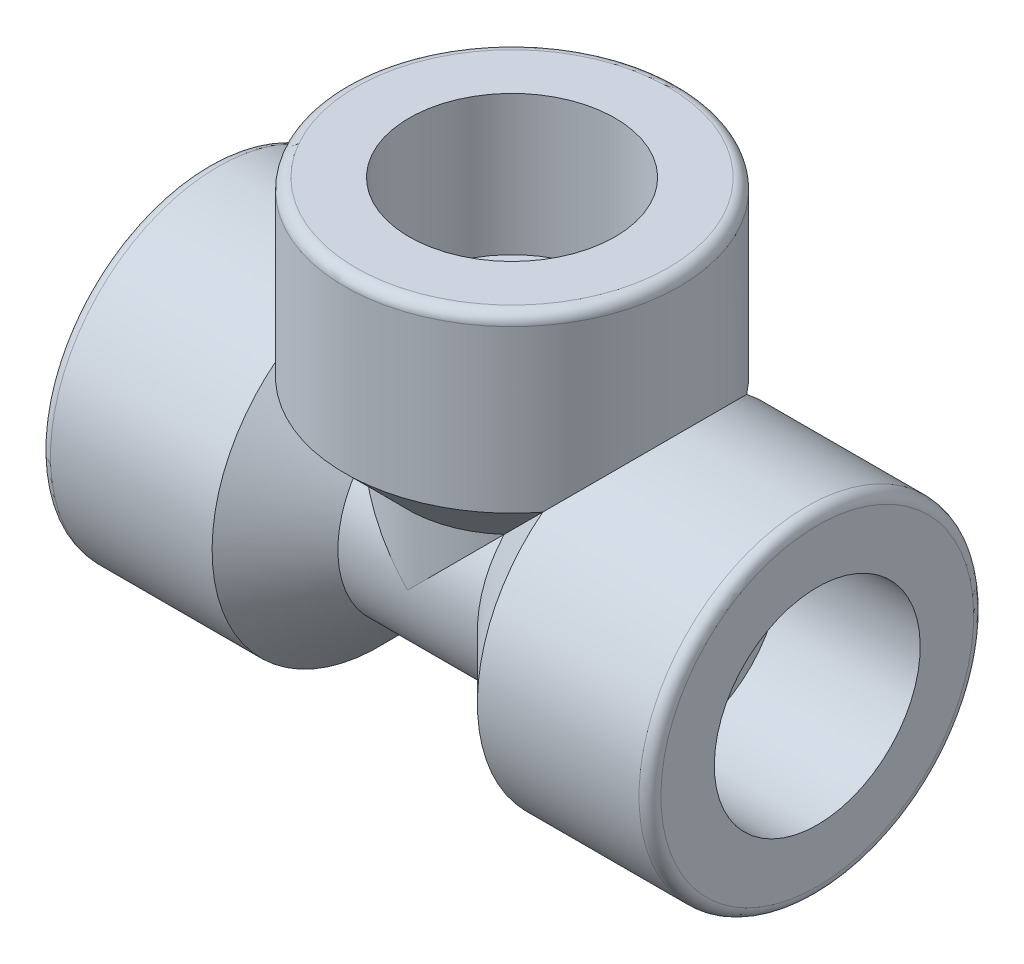
ISO-10303-21;
HEADER;
FILE_DESCRIPTION(('STEP AP214'),'2;1');
FILE_NAME('part.step','',(''),(''),'','','');
FILE_SCHEMA(('AUTOMOTIVE_DESIGN { 1 0 10303 214 1 1 1 1 }'));
ENDSEC;
DATA;
#1=APPLICATION_CONTEXT('core data for automotive mechanical design processes');
#2=APPLICATION_PROTOCOL_DEFINITION('international standard','automotive_design',2000,#1);
#3=PRODUCT_CONTEXT('',#1,'mechanical');
#4=PRODUCT('Part','Part','',(#3));
#5=PRODUCT_RELATED_PRODUCT_CATEGORY('part','',(#4));
#6=PRODUCT_DEFINITION_FORMATION('','',#4);
#7=PRODUCT_DEFINITION_CONTEXT('part definition',#1,'design');
#8=PRODUCT_DEFINITION('design','',#6,#7);
#9=PRODUCT_DEFINITION_SHAPE('','',#8);
#10=(LENGTH_UNIT() NAMED_UNIT(*) SI_UNIT(.MILLI.,.METRE.));
#11=(NAMED_UNIT(*) PLANE_ANGLE_UNIT() SI_UNIT($,.RADIAN.));
#12=(NAMED_UNIT(*) SI_UNIT($,.STERADIAN.) SOLID_ANGLE_UNIT());
#13=UNCERTAINTY_MEASURE_WITH_UNIT(LENGTH_MEASURE(1.E-05),#10,'distance_accuracy_value','');
#14=(GEOMETRIC_REPRESENTATION_CONTEXT(3) GLOBAL_UNCERTAINTY_ASSIGNED_CONTEXT((#13)) GLOBAL_UNIT_ASSIGNED_CONTEXT((#10,
#11,#12)) REPRESENTATION_CONTEXT('',''));
#15=CARTESIAN_POINT('',(0.,0.,0.));
#16=DIRECTION('',(0.,0.,1.));
#17=DIRECTION('',(1.,0.,0.));
#18=AXIS2_PLACEMENT_3D('',#15,#16,#17);
#19=CARTESIAN_POINT('',(0.,0.,0.));
#20=DIRECTION('',(1.,0.,0.));
#21=DIRECTION('',(0.,1.,0.));
#22=AXIS2_PLACEMENT_3D('',#19,#20,#21);
#23=CYLINDRICAL_SURFACE('',#22,4.191);
#24=CARTESIAN_POINT('',(11.43,0.,0.));
#25=DIRECTION('',(-1.,0.,0.));
#26=DIRECTION('',(0.,-1.,0.));
#27=AXIS2_PLACEMENT_3D('',#24,#25,#26);
#28=CIRCLE('',#27,4.191);
#29=CARTESIAN_POINT('',(11.43,-4.19100000000007,0.));
#30=VERTEX_POINT('',#29);
#31=EDGE_CURVE('E164',#30,#30,#28,.T.);
#32=ORIENTED_EDGE('',*,*,#31,.F.);
#33=EDGE_LOOP('',(#32));
#34=FACE_BOUND('',#33,.T.);
#35=CARTESIAN_POINT('',(-11.43,0.,0.));
#36=DIRECTION('',(1.,0.,0.));
#37=DIRECTION('',(0.,1.,0.));
#38=AXIS2_PLACEMENT_3D('',#35,#36,#37);
#39=CIRCLE('',#38,4.191);
#40=CARTESIAN_POINT('',(-11.43,4.19099999999999,0.));
#41=VERTEX_POINT('',#40);
#42=EDGE_CURVE('E293',#41,#41,#39,.T.);
#43=ORIENTED_EDGE('',*,*,#42,.F.);
#44=EDGE_LOOP('',(#43));
#45=FACE_BOUND('',#44,.T.);
#46=CARTESIAN_POINT('',(0.,0.,0.));
#47=DIRECTION('',(0.707106781186548,-0.707106781186548,0.));
#48=DIRECTION('',(0.707106781186548,0.707106781186547,0.));
#49=AXIS2_PLACEMENT_3D('',#46,#47,#48);
#50=ELLIPSE('',#49,5.92696903990564,4.191);
#51=CARTESIAN_POINT('',(0.,0.,-4.191));
#52=VERTEX_POINT('',#51);
#53=CARTESIAN_POINT('',(0.,0.,4.191));
#54=VERTEX_POINT('',#53);
#55=EDGE_CURVE('E115',#52,#54,#50,.T.);
#56=ORIENTED_EDGE('',*,*,#55,.F.);
#57=CARTESIAN_POINT('',(0.,0.,0.));
#58=DIRECTION('',(0.707106781186548,0.707106781186547,0.));
#59=DIRECTION('',(0.707106781186548,-0.707106781186548,0.));
#60=AXIS2_PLACEMENT_3D('',#57,#58,#59);
#61=ELLIPSE('',#60,5.92696903990564,4.191);
#62=EDGE_CURVE('E152',#54,#52,#61,.F.);
#63=ORIENTED_EDGE('',*,*,#62,.F.);
#64=EDGE_LOOP('',(#56,#63));
#65=FACE_BOUND('',#64,.T.);
#66=ADVANCED_FACE('F101',(#34,#45,#65),#23,.F.);
#67=CARTESIAN_POINT('',(0.,0.,0.));
#68=DIRECTION('',(1.,0.,0.));
#69=DIRECTION('',(0.,1.,0.));
#70=AXIS2_PLACEMENT_3D('',#67,#68,#69);
#71=CYLINDRICAL_SURFACE('',#70,11.557);
#72=CARTESIAN_POINT('',(-20.32635,0.,0.));
#73=DIRECTION('',(1.,0.,0.));
#74=DIRECTION('',(0.,1.,0.));
#75=AXIS2_PLACEMENT_3D('',#72,#73,#74);
#76=CIRCLE('',#75,11.557);
#77=CARTESIAN_POINT('',(-20.32635,11.557,0.));
#78=VERTEX_POINT('',#77);
#79=EDGE_CURVE('E109',#78,#78,#76,.T.);
#80=ORIENTED_EDGE('',*,*,#79,.T.);
#81=EDGE_LOOP('',(#80));
#82=FACE_BOUND('',#81,.T.);
#83=CARTESIAN_POINT('',(0.,0.,0.));
#84=DIRECTION('',(0.707106781186549,0.707106781186546,0.));
#85=DIRECTION('',(0.707106781186546,-0.707106781186549,0.));
#86=AXIS2_PLACEMENT_3D('',#83,#84,#85);
#87=ELLIPSE('',#86,16.3440661403458,11.557);
#88=CARTESIAN_POINT('',(-9.16304999999999,9.16305000000002,-7.04292295126813));
#89=VERTEX_POINT('',#88);
#90=CARTESIAN_POINT('',(-9.16304999999999,9.16305000000003,7.04292295126813));
#91=VERTEX_POINT('',#90);
#92=EDGE_CURVE('E122',#89,#91,#87,.T.);
#93=ORIENTED_EDGE('',*,*,#92,.F.);
#94=CARTESIAN_POINT('',(-9.16305,0.,0.));
#95=DIRECTION('',(1.,0.,0.));
#96=DIRECTION('',(0.,1.,0.));
#97=AXIS2_PLACEMENT_3D('',#94,#95,#96);
#98=CIRCLE('',#97,11.557);
#99=EDGE_CURVE('E299',#91,#89,#98,.T.);
#100=ORIENTED_EDGE('',*,*,#99,.F.);
#101=EDGE_LOOP('',(#93,#100));
#102=FACE_BOUND('',#101,.T.);
#103=ADVANCED_FACE('F247',(#82,#102),#71,.T.);
#104=CARTESIAN_POINT('',(-9.16305,0.,0.));
#105=DIRECTION('',(-1.,0.,0.));
#106=DIRECTION('',(0.,-1.,0.));
#107=AXIS2_PLACEMENT_3D('',#104,#105,#106);
#108=CONICAL_SURFACE('',#107,11.557,0.785398163397451);
#109=CARTESIAN_POINT('',(1.19697500001641,-1.19697500001643,4.4342035988794E-06));
#110=CARTESIAN_POINT('',(1.19697836620666,-1.19697836620423,-0.0376505705711459));
#111=CARTESIAN_POINT('',(1.19608613541275,-1.19608613540982,-0.0752938622259102));
#112=CARTESIAN_POINT('',(1.19254436069482,-1.19254436069239,-0.150401745617256));
#113=CARTESIAN_POINT('',(1.18989543995814,-1.18989543995672,-0.187866395981631));
#114=CARTESIAN_POINT('',(1.17939486010733,-1.1793948601077,-0.299466042307876));
#115=CARTESIAN_POINT('',(1.16898874466563,-1.16898874466556,-0.373145913181798));
#116=CARTESIAN_POINT('',(1.14229768219998,-1.14229768219964,-0.516557276062976));
#117=CARTESIAN_POINT('',(1.12614636715457,-1.12614636715439,-0.586339887954223));
#118=CARTESIAN_POINT('',(1.08873038336302,-1.08873038336298,-0.723152238154118));
#119=CARTESIAN_POINT('',(1.06746102034273,-1.06746102034267,-0.790179382681073));
#120=CARTESIAN_POINT('',(1.02180582651157,-1.02180582651151,-0.917917484823124));
#121=CARTESIAN_POINT('',(0.997625241455938,-0.997625241455905,-0.978776926741604));
#122=CARTESIAN_POINT('',(0.946060780068239,-0.946060780068226,-1.09767143684221));
#123=CARTESIAN_POINT('',(0.91867764128022,-0.918677641280203,-1.15570715098273));
#124=CARTESIAN_POINT('',(0.832254105448934,-0.832254105448912,-1.32637374393476));
#125=CARTESIAN_POINT('',(0.769179137362862,-0.769179137362846,-1.43492836300394));
#126=CARTESIAN_POINT('',(0.640377669111118,-0.640377669111109,-1.63531666088378));
#127=CARTESIAN_POINT('',(0.575131914273946,-0.575131914273939,-1.72778686550953));
#128=CARTESIAN_POINT('',(0.440201699604737,-0.440201699604734,-1.90558001014071));
#129=CARTESIAN_POINT('',(0.370525893855268,-0.370525893855269,-1.99091617438732));
#130=CARTESIAN_POINT('',(0.226850905695857,-0.226850905695859,-2.15680932278225));
#131=CARTESIAN_POINT('',(0.152806219096202,-0.152806219096201,-2.23728670692094));
#132=CARTESIAN_POINT('',(0.00206906022920148,-0.00206906022919983,-2.39314866258522));
#133=CARTESIAN_POINT('',(-0.0746241137424896,0.0746241137424894,-2.46853186854515));
#134=CARTESIAN_POINT('',(-0.225511065887696,0.225511065887695,-2.61064517767748));
#135=CARTESIAN_POINT('',(-0.299588591410893,0.299588591410891,-2.677623507081));
#136=CARTESIAN_POINT('',(-0.449216998526755,0.449216998526755,-2.80821270787426));
#137=CARTESIAN_POINT('',(-0.524768023636592,0.524768023636592,-2.87182324898128));
#138=CARTESIAN_POINT('',(-0.752505323377614,0.752505323377615,-3.05765742051496));
#139=CARTESIAN_POINT('',(-0.906470895010872,0.906470895010871,-3.17552451823402));
#140=CARTESIAN_POINT('',(-1.22077330781734,1.22077330781734,-3.40429728513316));
#141=CARTESIAN_POINT('',(-1.38117591445579,1.38117591445579,-3.51501991967286));
#142=CARTESIAN_POINT('',(-1.70474656907484,1.70474656907484,-3.72888530479324));
#143=CARTESIAN_POINT('',(-1.86791815238902,1.86791815238902,-3.83201730104152));
#144=CARTESIAN_POINT('',(-2.2693005762169,2.2693005762169,-4.07640708832778));
#145=CARTESIAN_POINT('',(-2.5085666082519,2.5085666082519,-4.21418886034261));
#146=CARTESIAN_POINT('',(-2.98998716639616,2.98998716639617,-4.47931662528661));
#147=CARTESIAN_POINT('',(-3.23214213696036,3.23214213696037,-4.60666098810027));
#148=CARTESIAN_POINT('',(-3.71857634660193,3.71857634660194,-4.852867354527));
#149=CARTESIAN_POINT('',(-3.96285548011577,3.96285548011577,-4.97172977699078));
#150=CARTESIAN_POINT('',(-4.45307442708693,4.45307442708694,-5.20241628188884));
#151=CARTESIAN_POINT('',(-4.69901432165255,4.69901432165256,-5.31424001777425));
#152=CARTESIAN_POINT('',(-5.43479618372402,5.43479618372403,-5.63907088831386));
#153=CARTESIAN_POINT('',(-5.92655595657114,5.92655595657115,-5.84339370881202));
#154=CARTESIAN_POINT('',(-6.91340923267632,6.91340923267634,-6.23455831723592));
#155=CARTESIAN_POINT('',(-7.40850220970608,7.4085022097061,-6.42140279824828));
#156=CARTESIAN_POINT('',(-8.5920904066062,8.59209040660622,-6.85064949322347));
#157=CARTESIAN_POINT('',(-9.28172109306981,9.28172109306984,-7.08677498511869));
#158=CARTESIAN_POINT('',(-10.6642645502998,10.6642645502999,-7.53932345815605));
#159=CARTESIAN_POINT('',(-11.3571777398874,11.3571777398874,-7.75574384973766));
#160=CARTESIAN_POINT('',(-12.7495452918229,12.7495452918229,-8.17426388250147));
#161=CARTESIAN_POINT('',(-13.44901384512,13.4490138451201,-8.37626877130608));
#162=CARTESIAN_POINT('',(-14.4994490088823,14.4994490088824,-8.66962631683147));
#163=CARTESIAN_POINT('',(-14.8497498014326,14.8497498014326,-8.76579094339621));
#164=CARTESIAN_POINT('',(-15.5507431988797,15.5507431988798,-8.95518609790618));
#165=CARTESIAN_POINT('',(-15.9014357985876,15.9014357985876,-9.04841666424365));
#166=CARTESIAN_POINT('',(-16.2523030226211,16.2523030226211,-9.14031718511586));
#167=B_SPLINE_CURVE_WITH_KNOTS('',3,(#109,#110,#111,#112,#113,#114,#115,#116,#117,#118,#119,
#120,#121,#122,#123,#124,#125,#126,#127,#128,#129,#130,#131,#132,#133,#134,#135,#136,#137,#138,
#139,#140,#141,#142,#143,#144,#145,#146,#147,#148,#149,#150,#151,#152,#153,#154,#155,#156,#157,
#158,#159,#160,#161,#162,#163,#164,#165,#166),.UNSPECIFIED.,.F.,.F.,(4,2,2,2,2,2,2,2,2,2,2,2,2,
2,2,2,2,2,2,2,2,2,2,2,2,2,2,2,4),(0.,0.112921576811569,0.2258031160053,0.450556616219099,
0.670391751304081,0.890429292952005,1.09962282808023,1.30876828072101,1.72920119538149,
2.12071729340295,2.51149076348252,2.90751364595729,3.30364227020766,3.67659711967938,
4.04958847774958,4.79205608614872,5.54915999472527,6.30731669685217,7.40312539873707,
8.49910491929498,9.59503028126114,10.6910095588379,12.8651998588656,15.0390546029517,
18.049139580089,21.0596195605723,24.0883467620669,25.6022820115838,27.1161974429796),.UNSPECIFIED.);
#168=CARTESIAN_POINT('',(-4.81965000000002,4.81965000000002,-5.36721518457195));
#169=VERTEX_POINT('',#168);
#170=EDGE_CURVE('E279',#169,#89,#167,.T.);
#171=ORIENTED_EDGE('',*,*,#170,.F.);
#172=CARTESIAN_POINT('',(-4.81965000000002,0.,0.));
#173=DIRECTION('',(1.,0.,0.));
#174=DIRECTION('',(0.,1.,0.));
#175=AXIS2_PLACEMENT_3D('',#172,#173,#174);
#176=CIRCLE('',#175,7.2136);
#177=CARTESIAN_POINT('',(-4.81965000000002,4.81965000000002,5.36721518457195));
#178=VERTEX_POINT('',#177);
#179=EDGE_CURVE('E296',#178,#169,#176,.T.);
#180=ORIENTED_EDGE('',*,*,#179,.F.);
#181=CARTESIAN_POINT('',(-16.0854125900472,16.0854125900472,9.09650172002422));
#182=CARTESIAN_POINT('',(-15.4339510477104,15.4339510477104,8.92495006252489));
#183=CARTESIAN_POINT('',(-14.7830664804659,14.783066480466,8.74890599160706));
#184=CARTESIAN_POINT('',(-13.4825170343036,13.4825170343037,8.38554939927521));
#185=CARTESIAN_POINT('',(-12.8328529838987,12.8328529838987,8.1982309594175));
#186=CARTESIAN_POINT('',(-11.4523427840635,11.4523427840635,7.78534805823336));
#187=CARTESIAN_POINT('',(-10.721766234564,10.7217662345641,7.55795905302697));
#188=CARTESIAN_POINT('',(-9.628722902629,9.62872290262903,7.20044870990384));
#189=CARTESIAN_POINT('',(-9.26490716180718,9.26490716180721,7.07856296971851));
#190=CARTESIAN_POINT('',(-8.53837371860589,8.53837371860592,6.82843683144562));
#191=CARTESIAN_POINT('',(-8.17565599271068,8.17565599271071,6.70019657048659));
#192=CARTESIAN_POINT('',(-7.46894056942904,7.46894056942907,6.44261722420037));
#193=CARTESIAN_POINT('',(-7.12487963760278,7.1248796376028,6.3136260358246));
#194=CARTESIAN_POINT('',(-6.43829917672166,6.43829917672168,6.04769566224292));
#195=CARTESIAN_POINT('',(-6.0957796143418,6.09577961434182,5.91075664977029));
#196=CARTESIAN_POINT('',(-5.41231293183799,5.412312931838,5.62714519981428));
#197=CARTESIAN_POINT('',(-5.07136813721994,5.07136813721996,5.48046149484933));
#198=CARTESIAN_POINT('',(-4.39220551291607,4.39220551291608,5.17530102861037));
#199=CARTESIAN_POINT('',(-4.05398703052978,4.05398703052979,5.01682718889586));
#200=CARTESIAN_POINT('',(-3.40735745009627,3.40735745009628,4.69772284873583));
#201=CARTESIAN_POINT('',(-3.098672176401,3.09867217640101,4.53821659689964));
#202=CARTESIAN_POINT('',(-2.63892143850963,2.63892143850964,4.28636114320928));
#203=CARTESIAN_POINT('',(-2.48614248669571,2.48614248669572,4.20026418354079));
#204=CARTESIAN_POINT('',(-2.18200613151679,2.1820061315168,4.02319275067455));
#205=CARTESIAN_POINT('',(-2.03064866796119,2.03064866796119,3.93221848510265));
#206=CARTESIAN_POINT('',(-1.72937060093615,1.72937060093615,3.74431582337524));
#207=CARTESIAN_POINT('',(-1.57945407736739,1.57945407736739,3.64737428037004));
#208=CARTESIAN_POINT('',(-1.28195932291795,1.28195932291795,3.44658856595852));
#209=CARTESIAN_POINT('',(-1.13438085421445,1.13438085421445,3.34274510225873));
#210=CARTESIAN_POINT('',(-0.84252062063191,0.842520620631908,3.12675251979719));
#211=CARTESIAN_POINT('',(-0.698234514074487,0.698234514074483,3.01461527885065));
#212=CARTESIAN_POINT('',(-0.485112848355794,0.48511284835579,2.83850158909801));
#213=CARTESIAN_POINT('',(-0.41463646990944,0.414636469909438,2.7784910688848));
#214=CARTESIAN_POINT('',(-0.275009416736295,0.275009416736294,2.65546674204897));
#215=CARTESIAN_POINT('',(-0.205858641577127,0.205858641577128,2.59245316421967));
#216=CARTESIAN_POINT('',(-0.0603972809061026,0.0603972809061043,2.45469154875406));
#217=CARTESIAN_POINT('',(0.0156930150347754,-0.0156930150347735,2.37947549517443));
#218=CARTESIAN_POINT('',(0.165201781596407,-0.165201781596405,2.22397690872858));
#219=CARTESIAN_POINT('',(0.238621466927465,-0.238621466927463,2.14369672585511));
#220=CARTESIAN_POINT('',(0.380829912622356,-0.380829912622353,1.97846843786975));
#221=CARTESIAN_POINT('',(0.449674576272804,-0.449674576272801,1.89361750921734));
#222=CARTESIAN_POINT('',(0.582963846973055,-0.582963846973053,1.71687379584102));
#223=CARTESIAN_POINT('',(0.647399829764682,-0.647399829764683,1.62496791538749));
#224=CARTESIAN_POINT('',(0.774547331373884,-0.774547331373879,1.42589356088552));
#225=CARTESIAN_POINT('',(0.83678339378687,-0.836783393786855,1.31809968973217));
#226=CARTESIAN_POINT('',(0.922038223437998,-0.922038223437981,1.14870454232127));
#227=CARTESIAN_POINT('',(0.949048443063641,-0.949048443063625,1.09111076241334));
#228=CARTESIAN_POINT('',(0.999906854131563,-0.99990685413152,0.973151884775891));
#229=CARTESIAN_POINT('',(1.02375432180886,-1.02375432180879,0.912786156953264));
#230=CARTESIAN_POINT('',(1.06887130419532,-1.06887130419528,0.785870182721644));
#231=CARTESIAN_POINT('',(1.08992247138616,-1.08992247138618,0.719162823306451));
#232=CARTESIAN_POINT('',(1.12694563962336,-1.12694563962316,0.583027930088218));
#233=CARTESIAN_POINT('',(1.14292218499438,-1.14292218499391,0.51360289291272));
#234=CARTESIAN_POINT('',(1.16931558766293,-1.16931558766304,0.370965823635463));
#235=CARTESIAN_POINT('',(1.17960141602561,-1.1796014160266,0.297703966159117));
#236=CARTESIAN_POINT('',(1.18997927857259,-1.18997927857111,0.186751235930064));
#237=CARTESIAN_POINT('',(1.19259690567115,-1.1925969056682,0.149507590766732));
#238=CARTESIAN_POINT('',(1.1960967098688,-1.19609670986497,0.074845007269023));
#239=CARTESIAN_POINT('',(1.19697828510917,-1.19697828510592,0.0374260126489613));
#240=CARTESIAN_POINT('',(1.19697500001678,-1.1969750000168,-4.48349426405145E-06));
#241=B_SPLINE_CURVE_WITH_KNOTS('',3,(#181,#182,#183,#184,#185,#186,#187,#188,#189,#190,#191,
#192,#193,#194,#195,#196,#197,#198,#199,#200,#201,#202,#203,#204,#205,#206,#207,#208,#209,#210,
#211,#212,#213,#214,#215,#216,#217,#218,#219,#220,#221,#222,#223,#224,#225,#226,#227,#228,#229,
#230,#231,#232,#233,#234,#235,#236,#237,#238,#239,#240),.UNSPECIFIED.,.F.,.F.,(4,2,2,2,2,2,2,2,
2,2,2,2,2,2,2,2,2,2,2,2,2,2,2,2,2,2,2,2,2,4),(0.,2.81143945539082,5.62436786141535,
8.79790579740941,10.3841339751362,11.9703279374561,13.4804215240812,14.9904823035136,
16.5023205762627,18.0137854599248,19.4078138368868,20.1055199143439,20.8031963141544,
21.5024690031235,22.2016701006219,22.8998885456742,23.248866689735,23.5978182886431,
23.9915604790179,24.3851212799136,24.7722800270107,25.1601756730447,25.5766027412811,
25.7837708578784,25.9909863013789,26.2097740667027,26.4283653515335,26.6517999466681,
26.7640098711448,26.8762586899902),.UNSPECIFIED.);
#242=EDGE_CURVE('E272',#91,#178,#241,.T.);
#243=ORIENTED_EDGE('',*,*,#242,.F.);
#244=ORIENTED_EDGE('',*,*,#99,.T.);
#245=EDGE_LOOP('',(#171,#180,#243,#244));
#246=FACE_BOUND('',#245,.T.);
#247=ADVANCED_FACE('F254',(#246),#108,.T.);
#248=CARTESIAN_POINT('',(0.,0.,0.));
#249=DIRECTION('',(1.,0.,0.));
#250=DIRECTION('',(0.,1.,0.));
#251=AXIS2_PLACEMENT_3D('',#248,#249,#250);
#252=CYLINDRICAL_SURFACE('',#251,7.2136);
#253=CARTESIAN_POINT('',(0.,0.,0.));
#254=DIRECTION('',(0.707106781186549,0.707106781186546,0.));
#255=DIRECTION('',(0.707106781186546,-0.707106781186549,0.));
#256=AXIS2_PLACEMENT_3D('',#253,#254,#255);
#257=ELLIPSE('',#256,10.2015709535345,7.2136);
#258=CARTESIAN_POINT('',(0.,0.,-7.2136));
#259=VERTEX_POINT('',#258);
#260=EDGE_CURVE('E472',#259,#169,#257,.T.);
#261=ORIENTED_EDGE('',*,*,#260,.F.);
#262=CARTESIAN_POINT('',(0.,0.,0.));
#263=DIRECTION('',(0.707106781186544,-0.707106781186551,0.));
#264=DIRECTION('',(-0.707106781186551,-0.707106781186544,0.));
#265=AXIS2_PLACEMENT_3D('',#262,#263,#264);
#266=ELLIPSE('',#265,10.2015709535345,7.2136);
#267=CARTESIAN_POINT('',(4.81965000000004,4.81965,-5.36721518457195));
#268=VERTEX_POINT('',#267);
#269=EDGE_CURVE('E182',#259,#268,#266,.T.);
#270=ORIENTED_EDGE('',*,*,#269,.T.);
#271=CARTESIAN_POINT('',(4.81965000000002,0.,0.));
#272=DIRECTION('',(-1.,0.,0.));
#273=DIRECTION('',(0.,-1.,0.));
#274=AXIS2_PLACEMENT_3D('',#271,#272,#273);
#275=CIRCLE('',#274,7.2136);
#276=CARTESIAN_POINT('',(4.81965000000004,4.81965,5.36721518457195));
#277=VERTEX_POINT('',#276);
#278=EDGE_CURVE('E167',#268,#277,#275,.T.);
#279=ORIENTED_EDGE('',*,*,#278,.T.);
#280=CARTESIAN_POINT('',(0.,0.,7.2136));
#281=VERTEX_POINT('',#280);
#282=EDGE_CURVE('E179',#277,#281,#266,.T.);
#283=ORIENTED_EDGE('',*,*,#282,.T.);
#284=EDGE_CURVE('E470',#178,#281,#257,.T.);
#285=ORIENTED_EDGE('',*,*,#284,.F.);
#286=ORIENTED_EDGE('',*,*,#179,.T.);
#287=EDGE_LOOP('',(#261,#270,#279,#283,#285,#286));
#288=FACE_BOUND('',#287,.T.);
#289=ADVANCED_FACE('F263',(#288),#252,.T.);
#290=CARTESIAN_POINT('',(-21.082,-7.112,0.));
#291=DIRECTION('',(1.,0.,0.));
#292=DIRECTION('',(0.,1.,0.));
#293=AXIS2_PLACEMENT_3D('',#290,#291,#292);
#294=PLANE('',#293);
#295=CARTESIAN_POINT('',(-21.082,0.,0.));
#296=DIRECTION('',(1.,0.,0.));
#297=DIRECTION('',(0.,1.,0.));
#298=AXIS2_PLACEMENT_3D('',#295,#296,#297);
#299=CIRCLE('',#298,10.80135);
#300=CARTESIAN_POINT('',(-21.082,10.80135,0.));
#301=VERTEX_POINT('',#300);
#302=EDGE_CURVE('E12',#301,#301,#299,.T.);
#303=ORIENTED_EDGE('',*,*,#302,.F.);
#304=EDGE_LOOP('',(#303));
#305=FACE_BOUND('',#304,.T.);
#306=CARTESIAN_POINT('',(-21.082,0.,0.));
#307=DIRECTION('',(1.,0.,0.));
#308=DIRECTION('',(0.,1.,0.));
#309=AXIS2_PLACEMENT_3D('',#306,#307,#308);
#310=CIRCLE('',#309,7.112);
#311=CARTESIAN_POINT('',(-21.082,7.112,0.));
#312=VERTEX_POINT('',#311);
#313=EDGE_CURVE('E287',#312,#312,#310,.T.);
#314=ORIENTED_EDGE('',*,*,#313,.T.);
#315=EDGE_LOOP('',(#314));
#316=FACE_BOUND('',#315,.T.);
#317=ADVANCED_FACE('F103',(#305,#316),#294,.F.);
#318=CARTESIAN_POINT('',(-20.32635,0.,0.));
#319=DIRECTION('',(1.,0.,0.));
#320=DIRECTION('',(0.,1.,0.));
#321=AXIS2_PLACEMENT_3D('',#318,#319,#320);
#322=TOROIDAL_SURFACE('',#321,10.80135,0.75565);
#323=ORIENTED_EDGE('',*,*,#79,.F.);
#324=EDGE_LOOP('',(#323));
#325=FACE_BOUND('',#324,.T.);
#326=ORIENTED_EDGE('',*,*,#302,.T.);
#327=EDGE_LOOP('',(#326));
#328=FACE_BOUND('',#327,.T.);
#329=ADVANCED_FACE('F303',(#325,#328),#322,.T.);
#330=CARTESIAN_POINT('',(-11.43,-7.112,0.));
#331=DIRECTION('',(1.,0.,0.));
#332=DIRECTION('',(0.,1.,0.));
#333=AXIS2_PLACEMENT_3D('',#330,#331,#332);
#334=PLANE('',#333);
#335=CARTESIAN_POINT('',(-11.43,0.,0.));
#336=DIRECTION('',(1.,0.,0.));
#337=DIRECTION('',(0.,1.,0.));
#338=AXIS2_PLACEMENT_3D('',#335,#336,#337);
#339=CIRCLE('',#338,7.112);
#340=CARTESIAN_POINT('',(-11.43,7.11199999999999,0.));
#341=VERTEX_POINT('',#340);
#342=EDGE_CURVE('E290',#341,#341,#339,.T.);
#343=ORIENTED_EDGE('',*,*,#342,.F.);
#344=EDGE_LOOP('',(#343));
#345=FACE_BOUND('',#344,.T.);
#346=ORIENTED_EDGE('',*,*,#42,.T.);
#347=EDGE_LOOP('',(#346));
#348=FACE_BOUND('',#347,.T.);
#349=ADVANCED_FACE('F261',(#345,#348),#334,.F.);
#350=CARTESIAN_POINT('',(0.,0.,0.));
#351=DIRECTION('',(1.,0.,0.));
#352=DIRECTION('',(0.,1.,0.));
#353=AXIS2_PLACEMENT_3D('',#350,#351,#352);
#354=CYLINDRICAL_SURFACE('',#353,7.112);
#355=ORIENTED_EDGE('',*,*,#313,.F.);
#356=EDGE_LOOP('',(#355));
#357=FACE_BOUND('',#356,.T.);
#358=ORIENTED_EDGE('',*,*,#342,.T.);
#359=EDGE_LOOP('',(#358));
#360=FACE_BOUND('',#359,.T.);
#361=ADVANCED_FACE('F312',(#357,#360),#354,.F.);
#362=CARTESIAN_POINT('',(0.,0.,0.));
#363=DIRECTION('',(0.,-1.,0.));
#364=DIRECTION('',(1.,0.,0.));
#365=AXIS2_PLACEMENT_3D('',#362,#363,#364);
#366=CYLINDRICAL_SURFACE('',#365,11.557);
#367=CARTESIAN_POINT('',(0.,20.32635,0.));
#368=DIRECTION('',(0.,-1.,0.));
#369=DIRECTION('',(1.,0.,0.));
#370=AXIS2_PLACEMENT_3D('',#367,#368,#369);
#371=CIRCLE('',#370,11.557);
#372=CARTESIAN_POINT('',(11.5570000000001,20.32635,0.));
#373=VERTEX_POINT('',#372);
#374=EDGE_CURVE('E466',#373,#373,#371,.T.);
#375=ORIENTED_EDGE('',*,*,#374,.T.);
#376=EDGE_LOOP('',(#375));
#377=FACE_BOUND('',#376,.T.);
#378=CARTESIAN_POINT('',(0.,9.16305,0.));
#379=DIRECTION('',(0.,-1.,0.));
#380=DIRECTION('',(1.,0.,0.));
#381=AXIS2_PLACEMENT_3D('',#378,#379,#380);
#382=CIRCLE('',#381,11.557);
#383=CARTESIAN_POINT('',(9.16305000000006,9.16304999999996,-7.04292295126813));
#384=VERTEX_POINT('',#383);
#385=EDGE_CURVE('E478',#89,#384,#382,.T.);
#386=ORIENTED_EDGE('',*,*,#385,.F.);
#387=ORIENTED_EDGE('',*,*,#92,.T.);
#388=CARTESIAN_POINT('',(9.16304999999969,9.16304999999996,7.0429229512686));
#389=VERTEX_POINT('',#388);
#390=EDGE_CURVE('E473',#389,#91,#382,.T.);
#391=ORIENTED_EDGE('',*,*,#390,.F.);
#392=CARTESIAN_POINT('',(0.,0.,0.));
#393=DIRECTION('',(0.707106781186544,-0.707106781186551,0.));
#394=DIRECTION('',(-0.707106781186551,-0.707106781186544,0.));
#395=AXIS2_PLACEMENT_3D('',#392,#393,#394);
#396=ELLIPSE('',#395,16.3440661403458,11.557);
#397=EDGE_CURVE('E491',#384,#389,#396,.T.);
#398=ORIENTED_EDGE('',*,*,#397,.F.);
#399=EDGE_LOOP('',(#386,#387,#391,#398));
#400=FACE_BOUND('',#399,.T.);
#401=ADVANCED_FACE('F315',(#377,#400),#366,.T.);
#402=CARTESIAN_POINT('',(0.,9.16305,0.));
#403=DIRECTION('',(0.,1.,0.));
#404=DIRECTION('',(-1.,0.,0.));
#405=AXIS2_PLACEMENT_3D('',#402,#403,#404);
#406=CONICAL_SURFACE('',#405,11.557,0.785398163397451);
#407=CARTESIAN_POINT('',(0.,4.81965000000002,0.));
#408=DIRECTION('',(0.,-1.,0.));
#409=DIRECTION('',(1.,0.,0.));
#410=AXIS2_PLACEMENT_3D('',#407,#408,#409);
#411=CIRCLE('',#410,7.2136);
#412=EDGE_CURVE('E482',#169,#268,#411,.T.);
#413=ORIENTED_EDGE('',*,*,#412,.F.);
#414=ORIENTED_EDGE('',*,*,#170,.T.);
#415=ORIENTED_EDGE('',*,*,#385,.T.);
#416=CARTESIAN_POINT('',(-1.19697500001644,-1.19697500001641,4.43422217016995E-06));
#417=CARTESIAN_POINT('',(-1.19697836619267,-1.19697836619538,-0.0376505386649304));
#418=CARTESIAN_POINT('',(-1.19608613691645,-1.1960861369197,-0.0752937984624332));
#419=CARTESIAN_POINT('',(-1.19254436817819,-1.19254436818083,-0.150401618609833));
#420=CARTESIAN_POINT('',(-1.18989545190044,-1.18989545190192,-0.187866237587186));
#421=CARTESIAN_POINT('',(-1.17939488953394,-1.17939488953341,-0.299465792016909));
#422=CARTESIAN_POINT('',(-1.168988791229,-1.16898879122904,-0.373145603509555));
#423=CARTESIAN_POINT('',(-1.14229777111418,-1.14229777111455,-0.51655685666126));
#424=CARTESIAN_POINT('',(-1.12614648089239,-1.12614648089253,-0.586339418011595));
#425=CARTESIAN_POINT('',(-1.08873055285983,-1.0887305528598,-0.723151672504108));
#426=CARTESIAN_POINT('',(-1.06746122079399,-1.06746122079402,-0.790178771877227));
#427=CARTESIAN_POINT('',(-1.02180609075679,-1.02180609075685,-0.917916793046498));
#428=CARTESIAN_POINT('',(-0.997625538226719,-0.997625538226755,-0.978776198803777));
#429=CARTESIAN_POINT('',(-0.946061144233819,-0.946061144233828,-1.09767064078424));
#430=CARTESIAN_POINT('',(-0.918678040312007,-0.918678040312017,-1.15570632296268));
#431=CARTESIAN_POINT('',(-0.832254612246659,-0.832254612246669,-1.3263728238699));
#432=CARTESIAN_POINT('',(-0.769179719464725,-0.76917971946473,-1.43492738821844));
#433=CARTESIAN_POINT('',(-0.64037839843336,-0.640378398433358,-1.63531559055353));
#434=CARTESIAN_POINT('',(-0.575132715301004,-0.575132715301003,-1.72778575364432));
#435=CARTESIAN_POINT('',(-0.440202644525717,-0.440202644525715,-1.90557882126733));
#436=CARTESIAN_POINT('',(-0.37052691094885,-0.370526910948847,-1.99091495000715));
#437=CARTESIAN_POINT('',(-0.226852068920373,-0.226852068920371,-2.15680803032537));
#438=CARTESIAN_POINT('',(-0.152807456309187,-0.152807456309185,-2.23728538199531));
#439=CARTESIAN_POINT('',(-0.00207044549341677,-0.00207044549341592,-2.39314727585173));
#440=CARTESIAN_POINT('',(0.074622654415967,0.0746226544159676,-2.46853045247247));
#441=CARTESIAN_POINT('',(0.225509475846285,0.225509475846283,-2.61064371924248));
#442=CARTESIAN_POINT('',(0.299586945037569,0.299586945037564,-2.67762203479675));
#443=CARTESIAN_POINT('',(0.449215240033559,0.449215240033553,-2.80821120847576));
#444=CARTESIAN_POINT('',(0.52476620935568,0.524766209355676,-2.87182173631741));
#445=CARTESIAN_POINT('',(0.752503343168397,0.752503343168393,-3.05765586909326));
#446=CARTESIAN_POINT('',(0.906468805311294,0.90646880531129,-3.17552294199359));
#447=CARTESIAN_POINT('',(1.2207709995059,1.22077099950589,-3.40429566109838));
#448=CARTESIAN_POINT('',(1.38117349707537,1.38117349707536,-3.51501827260467));
#449=CARTESIAN_POINT('',(1.7047439341416,1.70474393414158,-3.72888361250545));
#450=CARTESIAN_POINT('',(1.86791540897135,1.86791540897134,-3.83201558657428));
#451=CARTESIAN_POINT('',(2.26929782709508,2.26929782709505,-4.07640547836332));
#452=CARTESIAN_POINT('',(2.50856396664689,2.50856396664687,-4.21418736301104));
#453=CARTESIAN_POINT('',(2.98998474589817,2.98998474589814,-4.47931533469251));
#454=CARTESIAN_POINT('',(3.23213983005518,3.23213983005514,-4.60665979160166));
#455=CARTESIAN_POINT('',(3.71857427121294,3.7185742712129,-4.85286633294578));
#456=CARTESIAN_POINT('',(3.96285352265388,3.96285352265384,-4.97172883621665));
#457=CARTESIAN_POINT('',(4.45307270816347,4.45307270816343,-5.20241549257506));
#458=CARTESIAN_POINT('',(4.69901272334075,4.69901272334071,-5.31423929911235));
#459=CARTESIAN_POINT('',(5.43479494814157,5.43479494814151,-5.63907036889284));
#460=CARTESIAN_POINT('',(5.92655496584885,5.92655496584879,-5.84339330656798));
#461=CARTESIAN_POINT('',(6.91340873502617,6.9134087350261,-6.23455812946449));
#462=CARTESIAN_POINT('',(7.40850196026343,7.40850196026335,-6.42140270779528));
#463=CARTESIAN_POINT('',(8.59209041149717,8.59209041149708,-6.85064949498162));
#464=CARTESIAN_POINT('',(9.28172110286824,9.28172110286815,-7.08677498847161));
#465=CARTESIAN_POINT('',(10.6642645702035,10.6642645702033,-7.53932346452615));
#466=CARTESIAN_POINT('',(11.3571777649899,11.3571777649898,-7.75574385752317));
#467=CARTESIAN_POINT('',(12.7495453172461,12.749545317246,-8.17426388990162));
#468=CARTESIAN_POINT('',(13.449013865631,13.4490138656309,-8.3762687771332));
#469=CARTESIAN_POINT('',(14.4994490218763,14.4994490218762,-8.66962632041101));
#470=CARTESIAN_POINT('',(14.8497498118318,14.8497498118317,-8.76579094622847));
#471=CARTESIAN_POINT('',(15.5507432040837,15.5507432040835,-8.95518609928957));
#472=CARTESIAN_POINT('',(15.9014358011909,15.9014358011908,-9.04841666492545));
#473=CARTESIAN_POINT('',(16.2523030226211,16.2523030226209,-9.14031718511585));
#474=B_SPLINE_CURVE_WITH_KNOTS('',3,(#416,#417,#418,#419,#420,#421,#422,#423,#424,#425,#426,
#427,#428,#429,#430,#431,#432,#433,#434,#435,#436,#437,#438,#439,#440,#441,#442,#443,#444,#445,
#446,#447,#448,#449,#450,#451,#452,#453,#454,#455,#456,#457,#458,#459,#460,#461,#462,#463,#464,
#465,#466,#467,#468,#469,#470,#471,#472,#473),.UNSPECIFIED.,.F.,.F.,(4,2,2,2,2,2,2,2,2,2,2,2,2,
2,2,2,2,2,2,2,2,2,2,2,2,2,2,2,4),(0.,0.112921481258617,0.225802925062556,0.450556237866055,
0.670391196932864,0.890428561817314,1.09962193505053,1.30876722599571,1.72919981176881,
2.12071560679727,2.51148877573913,2.90751134997468,3.3036396659746,3.67659429166114,
4.04958542597329,4.79205259024317,5.54915605257292,6.30731230730279,7.40312155820882,
8.49910162852108,9.59502754221779,10.6910073716909,12.8651987668423,15.0390546034192,
18.0491396019353,21.0596196048633,24.0883467849994,25.6022820232823,27.1161974434458),.UNSPECIFIED.);
#475=EDGE_CURVE('E192',#268,#384,#474,.T.);
#476=ORIENTED_EDGE('',*,*,#475,.F.);
#477=EDGE_LOOP('',(#413,#414,#415,#476));
#478=FACE_BOUND('',#477,.T.);
#479=ADVANCED_FACE('F198',(#478),#406,.T.);
#480=ORIENTED_EDGE('',*,*,#390,.T.);
#481=ORIENTED_EDGE('',*,*,#242,.T.);
#482=EDGE_CURVE('E479',#277,#178,#411,.T.);
#483=ORIENTED_EDGE('',*,*,#482,.F.);
#484=CARTESIAN_POINT('',(12.0509957954128,12.0509957954127,7.96429277283102));
#485=CARTESIAN_POINT('',(11.5398150198831,11.539815019883,7.81054001475397));
#486=CARTESIAN_POINT('',(11.0292311524269,11.0292311524267,7.65271176736087));
#487=CARTESIAN_POINT('',(10.0095115569455,10.0095115569454,7.32683359048843));
#488=CARTESIAN_POINT('',(9.50037640238698,9.50037640238688,7.15878007997024));
#489=CARTESIAN_POINT('',(8.42498991524776,8.42498991524767,6.79020306505657));
#490=CARTESIAN_POINT('',(7.85899288063432,7.85899288063425,6.58817747757571));
#491=CARTESIAN_POINT('',(7.01278570139312,7.01278570139305,6.27045889114997));
#492=CARTESIAN_POINT('',(6.73119435370175,6.73119435370168,6.16211135526662));
#493=CARTESIAN_POINT('',(6.16913548587836,6.1691354858783,5.93974655549654));
#494=CARTESIAN_POINT('',(5.88866794028222,5.88866794028217,5.82572942087074));
#495=CARTESIAN_POINT('',(5.35849946673091,5.35849946673086,5.60338976447545));
#496=CARTESIAN_POINT('',(5.10866054580199,5.10866054580194,5.4957265724765));
#497=CARTESIAN_POINT('',(4.61036438487825,4.6103643848782,5.27420496623833));
#498=CARTESIAN_POINT('',(4.36190709575166,4.36190709575161,5.16034677387052));
#499=CARTESIAN_POINT('',(3.86663756931437,3.86663756931433,4.92523126713924));
#500=CARTESIAN_POINT('',(3.61982599198073,3.61982599198069,4.80397116161763));
#501=CARTESIAN_POINT('',(3.12850239998774,3.12850239998772,4.55255754657035));
#502=CARTESIAN_POINT('',(2.88399005969906,2.88399005969904,4.42240531864765));
#503=CARTESIAN_POINT('',(2.41460700999884,2.41460700999882,4.1602736549523));
#504=CARTESIAN_POINT('',(2.18953350324936,2.18953350324934,4.02902345576663));
#505=CARTESIAN_POINT('',(1.74293840552026,1.74293840552025,3.75432743159838));
#506=CARTESIAN_POINT('',(1.52141880261088,1.52141880261087,3.61087504526243));
#507=CARTESIAN_POINT('',(1.19291318578635,1.19291318578635,3.38352832358502));
#508=CARTESIAN_POINT('',(1.08386756237748,1.08386756237747,3.30558254289129));
#509=CARTESIAN_POINT('',(0.867520314577826,0.867520314577821,3.14500552655876));
#510=CARTESIAN_POINT('',(0.760218503603127,0.760218503603121,3.06237479650245));
#511=CARTESIAN_POINT('',(0.547917050411049,0.547917050411044,2.89165164390733));
#512=CARTESIAN_POINT('',(0.442915583324196,0.442915583324193,2.80356377985067));
#513=CARTESIAN_POINT('',(0.235840371748064,0.235840371748062,2.62079034630098));
#514=CARTESIAN_POINT('',(0.133765725218827,0.133765725218826,2.52610684110512));
#515=CARTESIAN_POINT('',(-0.0383540126388277,-0.0383540126388284,2.35635213775254));
#516=CARTESIAN_POINT('',(-0.109355373132545,-0.109355373132546,2.28322510984815));
#517=CARTESIAN_POINT('',(-0.248701477092516,-0.248701477092515,2.13212375804768));
#518=CARTESIAN_POINT('',(-0.317047324380778,-0.317047324380775,2.0541514839882));
#519=CARTESIAN_POINT('',(-0.449296218660017,-0.449296218660016,1.89371317633355));
#520=CARTESIAN_POINT('',(-0.513250835918893,-0.513250835918897,1.81133297157993));
#521=CARTESIAN_POINT('',(-0.636798870052422,-0.636798870052427,1.63994802065803));
#522=CARTESIAN_POINT('',(-0.696384800398397,-0.696384800398398,1.55093240661739));
#523=CARTESIAN_POINT('',(-0.81360384505328,-0.813603845053284,1.35848051656409));
#524=CARTESIAN_POINT('',(-0.870775390056558,-0.870775390056569,1.25446570036449));
#525=CARTESIAN_POINT('',(-0.9487958054922,-0.948795805492215,1.09141319055598));
#526=CARTESIAN_POINT('',(-0.973466988971404,-0.973466988971421,1.03602100847203));
#527=CARTESIAN_POINT('',(-1.01980975804904,-1.01980975804907,0.922745679175105));
#528=CARTESIAN_POINT('',(-1.04148080825853,-1.04148080825858,0.864862089767764));
#529=CARTESIAN_POINT('',(-1.08230596017195,-1.08230596017198,0.74356520108694));
#530=CARTESIAN_POINT('',(-1.10126798225918,-1.10126798225917,0.68002115769429));
#531=CARTESIAN_POINT('',(-1.13453752938946,-1.13453752938966,0.5505721931008));
#532=CARTESIAN_POINT('',(-1.1488484357087,-1.14884843570913,0.484669025808575));
#533=CARTESIAN_POINT('',(-1.17241007818505,-1.17241007818505,0.349645357533092));
#534=CARTESIAN_POINT('',(-1.18155503740862,-1.18155503740794,0.280486992708586));
#535=CARTESIAN_POINT('',(-1.19077105460251,-1.19077105460412,0.17587005099376));
#536=CARTESIAN_POINT('',(-1.19309292316633,-1.19309292316926,0.140786173676573));
#537=CARTESIAN_POINT('',(-1.19619632246382,-1.19619632246746,0.0704730339292969));
#538=CARTESIAN_POINT('',(-1.19697742922579,-1.19697742922884,0.0352437341549005));
#539=CARTESIAN_POINT('',(-1.19697500001976,-1.19697500001973,4.86198929021832E-06));
#540=B_SPLINE_CURVE_WITH_KNOTS('',3,(#484,#485,#486,#487,#488,#489,#490,#491,#492,#493,#494,
#495,#496,#497,#498,#499,#500,#501,#502,#503,#504,#505,#506,#507,#508,#509,#510,#511,#512,#513,
#514,#515,#516,#517,#518,#519,#520,#521,#522,#523,#524,#525,#526,#527,#528,#529,#530,#531,#532,
#533,#534,#535,#536,#537,#538,#539),.UNSPECIFIED.,.F.,.F.,(4,2,2,2,2,2,2,2,2,2,2,2,2,2,2,2,2,2,
2,2,2,2,2,2,2,2,2,4),(0.,2.21728187167101,4.43534478848777,6.91174794702038,8.1498347951912,
9.38789342920292,10.4959406289069,11.6039481704389,12.7123761385942,13.820644686999,
14.8533716829908,15.8866575500105,16.4049742096049,16.9232350404469,17.4410686444559,
17.9587408993535,18.3312725401604,18.7036476362712,19.070389290075,19.4377454032985,
19.8319695230377,20.0282144063794,20.2244942655919,20.4310873751243,20.6375299575336,
20.8480591901271,20.9537111086103,21.0593920952961),.UNSPECIFIED.);
#541=EDGE_CURVE('E183',#389,#277,#540,.T.);
#542=ORIENTED_EDGE('',*,*,#541,.F.);
#543=EDGE_LOOP('',(#480,#481,#483,#542));
#544=FACE_BOUND('',#543,.T.);
#545=ADVANCED_FACE('F238',(#544),#406,.T.);
#546=CARTESIAN_POINT('',(0.,0.,0.));
#547=DIRECTION('',(0.,-1.,0.));
#548=DIRECTION('',(1.,0.,0.));
#549=AXIS2_PLACEMENT_3D('',#546,#547,#548);
#550=CYLINDRICAL_SURFACE('',#549,7.2136);
#551=ORIENTED_EDGE('',*,*,#269,.F.);
#552=ORIENTED_EDGE('',*,*,#260,.T.);
#553=ORIENTED_EDGE('',*,*,#412,.T.);
#554=EDGE_LOOP('',(#551,#552,#553));
#555=FACE_BOUND('',#554,.T.);
#556=ADVANCED_FACE('F236',(#555),#550,.T.);
#557=ORIENTED_EDGE('',*,*,#482,.T.);
#558=ORIENTED_EDGE('',*,*,#284,.T.);
#559=ORIENTED_EDGE('',*,*,#282,.F.);
#560=EDGE_LOOP('',(#557,#558,#559));
#561=FACE_BOUND('',#560,.T.);
#562=ADVANCED_FACE('F234',(#561),#550,.T.);
#563=CARTESIAN_POINT('',(0.,0.,0.));
#564=DIRECTION('',(0.,-1.,0.));
#565=DIRECTION('',(1.,0.,0.));
#566=AXIS2_PLACEMENT_3D('',#563,#564,#565);
#567=CYLINDRICAL_SURFACE('',#566,4.191);
#568=CARTESIAN_POINT('',(0.,11.43,0.));
#569=DIRECTION('',(0.,-1.,0.));
#570=DIRECTION('',(1.,0.,0.));
#571=AXIS2_PLACEMENT_3D('',#568,#569,#570);
#572=CIRCLE('',#571,4.191);
#573=CARTESIAN_POINT('',(4.19100000000003,11.43,0.));
#574=VERTEX_POINT('',#573);
#575=EDGE_CURVE('E483',#574,#574,#572,.T.);
#576=ORIENTED_EDGE('',*,*,#575,.F.);
#577=EDGE_LOOP('',(#576));
#578=FACE_BOUND('',#577,.T.);
#579=ORIENTED_EDGE('',*,*,#55,.T.);
#580=ORIENTED_EDGE('',*,*,#62,.T.);
#581=EDGE_LOOP('',(#579,#580));
#582=FACE_BOUND('',#581,.T.);
#583=ADVANCED_FACE('F153',(#578,#582),#567,.F.);
#584=CARTESIAN_POINT('',(-7.11199999999993,21.082,0.));
#585=DIRECTION('',(0.,-1.,0.));
#586=DIRECTION('',(1.,0.,0.));
#587=AXIS2_PLACEMENT_3D('',#584,#585,#586);
#588=PLANE('',#587);
#589=CARTESIAN_POINT('',(0.,21.082,0.));
#590=DIRECTION('',(0.,-1.,0.));
#591=DIRECTION('',(1.,0.,0.));
#592=AXIS2_PLACEMENT_3D('',#589,#590,#591);
#593=CIRCLE('',#592,10.80135);
#594=CARTESIAN_POINT('',(10.8013500000001,21.082,0.));
#595=VERTEX_POINT('',#594);
#596=EDGE_CURVE('E469',#595,#595,#593,.T.);
#597=ORIENTED_EDGE('',*,*,#596,.F.);
#598=EDGE_LOOP('',(#597));
#599=FACE_BOUND('',#598,.T.);
#600=CARTESIAN_POINT('',(0.,21.082,0.));
#601=DIRECTION('',(0.,-1.,0.));
#602=DIRECTION('',(1.,0.,0.));
#603=AXIS2_PLACEMENT_3D('',#600,#601,#602);
#604=CIRCLE('',#603,7.112);
#605=CARTESIAN_POINT('',(7.11200000000007,21.082,0.));
#606=VERTEX_POINT('',#605);
#607=EDGE_CURVE('E489',#606,#606,#604,.T.);
#608=ORIENTED_EDGE('',*,*,#607,.T.);
#609=EDGE_LOOP('',(#608));
#610=FACE_BOUND('',#609,.T.);
#611=ADVANCED_FACE('F233',(#599,#610),#588,.F.);
#612=CARTESIAN_POINT('',(0.,20.32635,0.));
#613=DIRECTION('',(0.,-1.,0.));
#614=DIRECTION('',(1.,0.,0.));
#615=AXIS2_PLACEMENT_3D('',#612,#613,#614);
#616=TOROIDAL_SURFACE('',#615,10.80135,0.75565);
#617=ORIENTED_EDGE('',*,*,#374,.F.);
#618=EDGE_LOOP('',(#617));
#619=FACE_BOUND('',#618,.T.);
#620=ORIENTED_EDGE('',*,*,#596,.T.);
#621=EDGE_LOOP('',(#620));
#622=FACE_BOUND('',#621,.T.);
#623=ADVANCED_FACE('F230',(#619,#622),#616,.T.);
#624=CARTESIAN_POINT('',(-7.11199999999996,11.43,0.));
#625=DIRECTION('',(0.,-1.,0.));
#626=DIRECTION('',(1.,0.,0.));
#627=AXIS2_PLACEMENT_3D('',#624,#625,#626);
#628=PLANE('',#627);
#629=CARTESIAN_POINT('',(0.,11.43,0.));
#630=DIRECTION('',(0.,-1.,0.));
#631=DIRECTION('',(1.,0.,0.));
#632=AXIS2_PLACEMENT_3D('',#629,#630,#631);
#633=CIRCLE('',#632,7.112);
#634=CARTESIAN_POINT('',(7.11200000000003,11.43,0.));
#635=VERTEX_POINT('',#634);
#636=EDGE_CURVE('E486',#635,#635,#633,.T.);
#637=ORIENTED_EDGE('',*,*,#636,.F.);
#638=EDGE_LOOP('',(#637));
#639=FACE_BOUND('',#638,.T.);
#640=ORIENTED_EDGE('',*,*,#575,.T.);
#641=EDGE_LOOP('',(#640));
#642=FACE_BOUND('',#641,.T.);
#643=ADVANCED_FACE('F226',(#639,#642),#628,.F.);
#644=CARTESIAN_POINT('',(0.,0.,0.));
#645=DIRECTION('',(0.,-1.,0.));
#646=DIRECTION('',(1.,0.,0.));
#647=AXIS2_PLACEMENT_3D('',#644,#645,#646);
#648=CYLINDRICAL_SURFACE('',#647,7.112);
#649=ORIENTED_EDGE('',*,*,#607,.F.);
#650=EDGE_LOOP('',(#649));
#651=FACE_BOUND('',#650,.T.);
#652=ORIENTED_EDGE('',*,*,#636,.T.);
#653=EDGE_LOOP('',(#652));
#654=FACE_BOUND('',#653,.T.);
#655=ADVANCED_FACE('F215',(#651,#654),#648,.F.);
#656=CARTESIAN_POINT('',(0.,0.,0.));
#657=DIRECTION('',(-1.,0.,0.));
#658=DIRECTION('',(0.,-1.,0.));
#659=AXIS2_PLACEMENT_3D('',#656,#657,#658);
#660=CYLINDRICAL_SURFACE('',#659,11.557);
#661=CARTESIAN_POINT('',(20.32635,-1.39200252321754E-13,0.));
#662=DIRECTION('',(-1.,0.,0.));
#663=DIRECTION('',(0.,-1.,0.));
#664=AXIS2_PLACEMENT_3D('',#661,#662,#663);
#665=CIRCLE('',#664,11.557);
#666=CARTESIAN_POINT('',(20.3263499999999,-11.5570000000001,0.));
#667=VERTEX_POINT('',#666);
#668=EDGE_CURVE('E173',#667,#667,#665,.T.);
#669=ORIENTED_EDGE('',*,*,#668,.T.);
#670=EDGE_LOOP('',(#669));
#671=FACE_BOUND('',#670,.T.);
#672=CARTESIAN_POINT('',(9.16305,0.,0.));
#673=DIRECTION('',(-1.,0.,0.));
#674=DIRECTION('',(0.,-1.,0.));
#675=AXIS2_PLACEMENT_3D('',#672,#673,#674);
#676=CIRCLE('',#675,11.557);
#677=EDGE_CURVE('E170',#384,#389,#676,.T.);
#678=ORIENTED_EDGE('',*,*,#677,.F.);
#679=ORIENTED_EDGE('',*,*,#397,.T.);
#680=EDGE_LOOP('',(#678,#679));
#681=FACE_BOUND('',#680,.T.);
#682=ADVANCED_FACE('F208',(#671,#681),#660,.T.);
#683=CARTESIAN_POINT('',(9.16305,0.,0.));
#684=DIRECTION('',(1.,0.,0.));
#685=DIRECTION('',(0.,1.,0.));
#686=AXIS2_PLACEMENT_3D('',#683,#684,#685);
#687=CONICAL_SURFACE('',#686,11.557,0.785398163397451);
#688=ORIENTED_EDGE('',*,*,#278,.F.);
#689=ORIENTED_EDGE('',*,*,#475,.T.);
#690=ORIENTED_EDGE('',*,*,#677,.T.);
#691=ORIENTED_EDGE('',*,*,#541,.T.);
#692=EDGE_LOOP('',(#688,#689,#690,#691));
#693=FACE_BOUND('',#692,.T.);
#694=ADVANCED_FACE('F202',(#693),#687,.T.);
#695=CARTESIAN_POINT('',(21.082,7.11199999999986,0.));
#696=DIRECTION('',(-1.,0.,0.));
#697=DIRECTION('',(0.,-1.,0.));
#698=AXIS2_PLACEMENT_3D('',#695,#696,#697);
#699=PLANE('',#698);
#700=CARTESIAN_POINT('',(21.082,-1.44633104055854E-13,0.));
#701=DIRECTION('',(-1.,0.,0.));
#702=DIRECTION('',(0.,-1.,0.));
#703=AXIS2_PLACEMENT_3D('',#700,#701,#702);
#704=CIRCLE('',#703,10.80135);
#705=CARTESIAN_POINT('',(21.0819999999999,-10.8013500000001,0.));
#706=VERTEX_POINT('',#705);
#707=EDGE_CURVE('E176',#706,#706,#704,.T.);
#708=ORIENTED_EDGE('',*,*,#707,.F.);
#709=EDGE_LOOP('',(#708));
#710=FACE_BOUND('',#709,.T.);
#711=CARTESIAN_POINT('',(21.082,-1.44633104055854E-13,0.));
#712=DIRECTION('',(-1.,0.,0.));
#713=DIRECTION('',(0.,-1.,0.));
#714=AXIS2_PLACEMENT_3D('',#711,#712,#713);
#715=CIRCLE('',#714,7.112);
#716=CARTESIAN_POINT('',(21.0819999999999,-7.11200000000014,0.));
#717=VERTEX_POINT('',#716);
#718=EDGE_CURVE('E156',#717,#717,#715,.T.);
#719=ORIENTED_EDGE('',*,*,#718,.T.);
#720=EDGE_LOOP('',(#719));
#721=FACE_BOUND('',#720,.T.);
#722=ADVANCED_FACE('F207',(#710,#721),#699,.F.);
#723=CARTESIAN_POINT('',(20.32635,-1.38468778682218E-13,0.));
#724=DIRECTION('',(-1.,0.,0.));
#725=DIRECTION('',(0.,-1.,0.));
#726=AXIS2_PLACEMENT_3D('',#723,#724,#725);
#727=TOROIDAL_SURFACE('',#726,10.80135,0.75565);
#728=ORIENTED_EDGE('',*,*,#668,.F.);
#729=EDGE_LOOP('',(#728));
#730=FACE_BOUND('',#729,.T.);
#731=ORIENTED_EDGE('',*,*,#707,.T.);
#732=EDGE_LOOP('',(#731));
#733=FACE_BOUND('',#732,.T.);
#734=ADVANCED_FACE('F217',(#730,#733),#727,.T.);
#735=CARTESIAN_POINT('',(11.43,7.11199999999992,0.));
#736=DIRECTION('',(-1.,0.,0.));
#737=DIRECTION('',(0.,-1.,0.));
#738=AXIS2_PLACEMENT_3D('',#735,#736,#737);
#739=PLANE('',#738);
#740=CARTESIAN_POINT('',(11.43,0.,0.));
#741=DIRECTION('',(-1.,0.,0.));
#742=DIRECTION('',(0.,-1.,0.));
#743=AXIS2_PLACEMENT_3D('',#740,#741,#742);
#744=CIRCLE('',#743,7.112);
#745=CARTESIAN_POINT('',(11.4299999999999,-7.11200000000007,0.));
#746=VERTEX_POINT('',#745);
#747=EDGE_CURVE('E159',#746,#746,#744,.T.);
#748=ORIENTED_EDGE('',*,*,#747,.F.);
#749=EDGE_LOOP('',(#748));
#750=FACE_BOUND('',#749,.T.);
#751=ORIENTED_EDGE('',*,*,#31,.T.);
#752=EDGE_LOOP('',(#751));
#753=FACE_BOUND('',#752,.T.);
#754=ADVANCED_FACE('F210',(#750,#753),#739,.F.);
#755=CARTESIAN_POINT('',(0.,0.,0.));
#756=DIRECTION('',(-1.,0.,0.));
#757=DIRECTION('',(0.,-1.,0.));
#758=AXIS2_PLACEMENT_3D('',#755,#756,#757);
#759=CYLINDRICAL_SURFACE('',#758,7.112);
#760=ORIENTED_EDGE('',*,*,#718,.F.);
#761=EDGE_LOOP('',(#760));
#762=FACE_BOUND('',#761,.T.);
#763=ORIENTED_EDGE('',*,*,#747,.T.);
#764=EDGE_LOOP('',(#763));
#765=FACE_BOUND('',#764,.T.);
#766=ADVANCED_FACE('F439',(#762,#765),#759,.F.);
#767=CLOSED_SHELL('',(#66,#103,#247,#289,#317,#329,#349,#361,#401,#479,#545,#556,#562,#583,#611,
#623,#643,#655,#682,#694,#722,#734,#754,#766));
#768=MANIFOLD_SOLID_BREP('B2',#767);
#769=ADVANCED_BREP_SHAPE_REPRESENTATION('',(#18,#768),#14);
#770=SHAPE_DEFINITION_REPRESENTATION(#9,#769);
ENDSEC;
END-ISO-10303-21;
